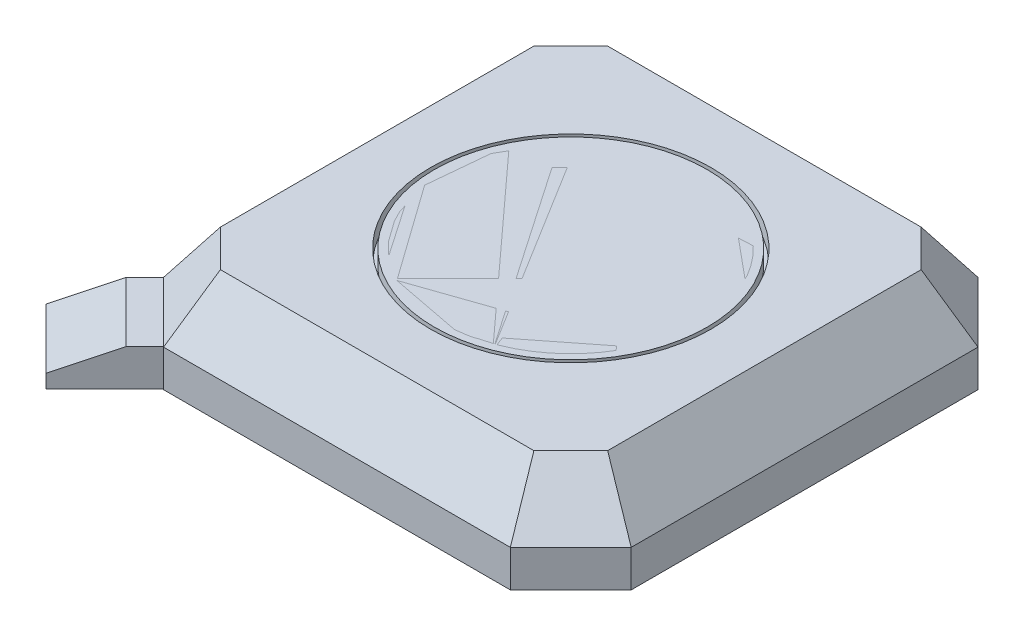
ISO-10303-21;
HEADER;
FILE_DESCRIPTION(('STEP AP214'),'2;1');
FILE_NAME('part.step','',(''),(''),'','','');
FILE_SCHEMA(('AUTOMOTIVE_DESIGN { 1 0 10303 214 1 1 1 1 }'));
ENDSEC;
DATA;
#1=APPLICATION_CONTEXT('core data for automotive mechanical design processes');
#2=APPLICATION_PROTOCOL_DEFINITION('international standard','automotive_design',2000,#1);
#3=PRODUCT_CONTEXT('',#1,'mechanical');
#4=PRODUCT('Part','Part','',(#3));
#5=PRODUCT_RELATED_PRODUCT_CATEGORY('part','',(#4));
#6=PRODUCT_DEFINITION_FORMATION('','',#4);
#7=PRODUCT_DEFINITION_CONTEXT('part definition',#1,'design');
#8=PRODUCT_DEFINITION('design','',#6,#7);
#9=PRODUCT_DEFINITION_SHAPE('','',#8);
#10=(LENGTH_UNIT() NAMED_UNIT(*) SI_UNIT(.MILLI.,.METRE.));
#11=(NAMED_UNIT(*) PLANE_ANGLE_UNIT() SI_UNIT($,.RADIAN.));
#12=(NAMED_UNIT(*) SI_UNIT($,.STERADIAN.) SOLID_ANGLE_UNIT());
#13=UNCERTAINTY_MEASURE_WITH_UNIT(LENGTH_MEASURE(1.E-05),#10,'distance_accuracy_value','');
#14=(GEOMETRIC_REPRESENTATION_CONTEXT(3) GLOBAL_UNCERTAINTY_ASSIGNED_CONTEXT((#13)) GLOBAL_UNIT_ASSIGNED_CONTEXT((#10,
#11,#12)) REPRESENTATION_CONTEXT('',''));
#15=CARTESIAN_POINT('',(0.,0.,0.));
#16=DIRECTION('',(0.,0.,1.));
#17=DIRECTION('',(1.,0.,0.));
#18=AXIS2_PLACEMENT_3D('',#15,#16,#17);
#19=CARTESIAN_POINT('',(-47.1346819527898,-25.,63.2776124984004));
#20=DIRECTION('',(-0.707106781186548,0.,0.707106781186547));
#21=DIRECTION('',(0.707106781186547,0.,0.707106781186548));
#22=AXIS2_PLACEMENT_3D('',#19,#20,#21);
#23=PLANE('',#22);
#24=DIRECTION('',(0.,1.,0.));
#25=VECTOR('',#24,1.);
#26=CARTESIAN_POINT('',(-63.3981379200804,-25.,47.0141565311099));
#27=LINE('',#26,#25);
#28=CARTESIAN_POINT('',(-63.3981379200804,-25.,47.0141565311099));
#29=VERTEX_POINT('',#28);
#30=CARTESIAN_POINT('',(-63.3981379200804,-15.,47.0141565311099));
#31=VERTEX_POINT('',#30);
#32=EDGE_CURVE('E126',#29,#31,#27,.T.);
#33=ORIENTED_EDGE('',*,*,#32,.T.);
#34=DIRECTION('',(-0.707106781186547,0.,-0.707106781186548));
#35=VECTOR('',#34,1.);
#36=CARTESIAN_POINT('',(-47.1346819527898,-15.,63.2776124984004));
#37=LINE('',#36,#35);
#38=CARTESIAN_POINT('',(-47.1346819527898,-15.,63.2776124984004));
#39=VERTEX_POINT('',#38);
#40=EDGE_CURVE('E12',#39,#31,#37,.T.);
#41=ORIENTED_EDGE('',*,*,#40,.F.);
#42=DIRECTION('',(0.,1.,0.));
#43=VECTOR('',#42,1.);
#44=CARTESIAN_POINT('',(-47.1346819527898,-25.,63.2776124984004));
#45=LINE('',#44,#43);
#46=CARTESIAN_POINT('',(-47.1346819527898,-25.,63.2776124984004));
#47=VERTEX_POINT('',#46);
#48=EDGE_CURVE('E134',#47,#39,#45,.T.);
#49=ORIENTED_EDGE('',*,*,#48,.F.);
#50=DIRECTION('',(-0.707106781186547,0.,-0.707106781186548));
#51=VECTOR('',#50,1.);
#52=CARTESIAN_POINT('',(-47.1346819527898,-25.,63.2776124984004));
#53=LINE('',#52,#51);
#54=EDGE_CURVE('E122',#47,#29,#53,.T.);
#55=ORIENTED_EDGE('',*,*,#54,.T.);
#56=EDGE_LOOP('',(#33,#41,#49,#55));
#57=FACE_BOUND('',#56,.T.);
#58=ADVANCED_FACE('F52',(#57),#23,.F.);
#59=CARTESIAN_POINT('',(-47.1346819527898,-15.,63.2776124984004));
#60=DIRECTION('',(0.,-1.,0.));
#61=DIRECTION('',(0.,0.,-1.));
#62=AXIS2_PLACEMENT_3D('',#59,#60,#61);
#63=PLANE('',#62);
#64=DIRECTION('',(-0.707106781186547,0.,0.707106781186547));
#65=VECTOR('',#64,1.);
#66=CARTESIAN_POINT('',(-63.3981379200804,-15.,47.0141565311099));
#67=LINE('',#66,#65);
#68=CARTESIAN_POINT('',(-68.474182046728,-15.,52.0902006577574));
#69=VERTEX_POINT('',#68);
#70=EDGE_CURVE('E129',#31,#69,#67,.T.);
#71=ORIENTED_EDGE('',*,*,#70,.T.);
#72=DIRECTION('',(-0.707106781186547,0.,-0.707106781186548));
#73=VECTOR('',#72,1.);
#74=CARTESIAN_POINT('',(-52.2107260794374,-15.,68.353656625048));
#75=LINE('',#74,#73);
#76=CARTESIAN_POINT('',(-52.2107260794374,-15.,68.353656625048));
#77=VERTEX_POINT('',#76);
#78=EDGE_CURVE('E60',#77,#69,#75,.T.);
#79=ORIENTED_EDGE('',*,*,#78,.F.);
#80=DIRECTION('',(-0.707106781186547,0.,0.707106781186547));
#81=VECTOR('',#80,1.);
#82=CARTESIAN_POINT('',(-47.1346819527898,-15.,63.2776124984004));
#83=LINE('',#82,#81);
#84=EDGE_CURVE('E102',#39,#77,#83,.T.);
#85=ORIENTED_EDGE('',*,*,#84,.F.);
#86=ORIENTED_EDGE('',*,*,#40,.T.);
#87=EDGE_LOOP('',(#71,#79,#85,#86));
#88=FACE_BOUND('',#87,.T.);
#89=ADVANCED_FACE('F153',(#88),#63,.F.);
#90=CARTESIAN_POINT('',(-52.2107260794374,-15.,68.353656625048));
#91=DIRECTION('',(0.266835046425211,-0.926065935016784,-0.266835046425211));
#92=DIRECTION('',(0.960906267352022,0.276873879886864,0.));
#93=AXIS2_PLACEMENT_3D('',#90,#91,#92);
#94=PLANE('',#93);
#95=DIRECTION('',(-0.654827502476229,-0.377361741570988,0.654827502476228));
#96=VECTOR('',#95,1.);
#97=CARTESIAN_POINT('',(-68.474182046728,-15.,52.0902006577574));
#98=LINE('',#97,#96);
#99=CARTESIAN_POINT('',(-79.3343600134854,-21.2584660170947,62.9503786245148));
#100=VERTEX_POINT('',#99);
#101=EDGE_CURVE('E117',#69,#100,#98,.T.);
#102=ORIENTED_EDGE('',*,*,#101,.T.);
#103=DIRECTION('',(-0.707106781186547,0.,-0.707106781186548));
#104=VECTOR('',#103,1.);
#105=CARTESIAN_POINT('',(-63.0709040461948,-21.2584660170947,79.2138345918055));
#106=LINE('',#105,#104);
#107=CARTESIAN_POINT('',(-63.0709040461948,-21.2584660170947,79.2138345918055));
#108=VERTEX_POINT('',#107);
#109=EDGE_CURVE('E114',#108,#100,#106,.T.);
#110=ORIENTED_EDGE('',*,*,#109,.F.);
#111=DIRECTION('',(-0.654827502476229,-0.377361741570988,0.654827502476228));
#112=VECTOR('',#111,1.);
#113=CARTESIAN_POINT('',(-52.2107260794374,-15.,68.353656625048));
#114=LINE('',#113,#112);
#115=EDGE_CURVE('E106',#77,#108,#114,.T.);
#116=ORIENTED_EDGE('',*,*,#115,.F.);
#117=ORIENTED_EDGE('',*,*,#78,.T.);
#118=EDGE_LOOP('',(#102,#110,#116,#117));
#119=FACE_BOUND('',#118,.T.);
#120=ADVANCED_FACE('F115',(#119),#94,.F.);
#121=CARTESIAN_POINT('',(-63.0709040461948,-21.2584660170947,79.2138345918055));
#122=DIRECTION('',(0.707106781186548,0.,-0.707106781186547));
#123=DIRECTION('',(-0.707106781186547,0.,-0.707106781186548));
#124=AXIS2_PLACEMENT_3D('',#121,#122,#123);
#125=PLANE('',#124);
#126=DIRECTION('',(0.,-1.,0.));
#127=VECTOR('',#126,1.);
#128=CARTESIAN_POINT('',(-79.3343600134854,-21.2584660170947,62.9503786245148));
#129=LINE('',#128,#127);
#130=CARTESIAN_POINT('',(-79.3343600134854,-25.,62.9503786245148));
#131=VERTEX_POINT('',#130);
#132=EDGE_CURVE('E88',#100,#131,#129,.T.);
#133=ORIENTED_EDGE('',*,*,#132,.T.);
#134=DIRECTION('',(-0.707106781186547,0.,-0.707106781186548));
#135=VECTOR('',#134,1.);
#136=CARTESIAN_POINT('',(-63.0709040461948,-25.,79.2138345918055));
#137=LINE('',#136,#135);
#138=CARTESIAN_POINT('',(-63.0709040461948,-25.,79.2138345918055));
#139=VERTEX_POINT('',#138);
#140=EDGE_CURVE('E118',#139,#131,#137,.T.);
#141=ORIENTED_EDGE('',*,*,#140,.F.);
#142=DIRECTION('',(0.,-1.,0.));
#143=VECTOR('',#142,1.);
#144=CARTESIAN_POINT('',(-63.0709040461948,-21.2584660170947,79.2138345918055));
#145=LINE('',#144,#143);
#146=EDGE_CURVE('E110',#108,#139,#145,.T.);
#147=ORIENTED_EDGE('',*,*,#146,.F.);
#148=ORIENTED_EDGE('',*,*,#109,.T.);
#149=EDGE_LOOP('',(#133,#141,#147,#148));
#150=FACE_BOUND('',#149,.T.);
#151=ADVANCED_FACE('F120',(#150),#125,.F.);
#152=CARTESIAN_POINT('',(-63.0709040461948,-25.,79.2138345918055));
#153=DIRECTION('',(0.,1.,0.));
#154=DIRECTION('',(0.,0.,1.));
#155=AXIS2_PLACEMENT_3D('',#152,#153,#154);
#156=PLANE('',#155);
#157=DIRECTION('',(0.707106781186548,0.,-0.707106781186547));
#158=VECTOR('',#157,1.);
#159=CARTESIAN_POINT('',(-79.3343600134854,-25.,62.9503786245148));
#160=LINE('',#159,#158);
#161=EDGE_CURVE('E94',#131,#29,#160,.T.);
#162=ORIENTED_EDGE('',*,*,#161,.T.);
#163=ORIENTED_EDGE('',*,*,#54,.F.);
#164=DIRECTION('',(0.707106781186548,0.,-0.707106781186547));
#165=VECTOR('',#164,1.);
#166=CARTESIAN_POINT('',(-63.0709040461948,-25.,79.2138345918055));
#167=LINE('',#166,#165);
#168=EDGE_CURVE('E68',#139,#47,#167,.T.);
#169=ORIENTED_EDGE('',*,*,#168,.F.);
#170=ORIENTED_EDGE('',*,*,#140,.T.);
#171=EDGE_LOOP('',(#162,#163,#169,#170));
#172=FACE_BOUND('',#171,.T.);
#173=ADVANCED_FACE('F142',(#172),#156,.F.);
#174=CARTESIAN_POINT('',(8.07146527280531,0.,8.07146527280532));
#175=DIRECTION('',(0.707106781186548,0.,0.707106781186548));
#176=DIRECTION('',(0.707106781186548,0.,-0.707106781186548));
#177=AXIS2_PLACEMENT_3D('',#174,#175,#176);
#178=PLANE('',#177);
#179=ORIENTED_EDGE('',*,*,#48,.T.);
#180=ORIENTED_EDGE('',*,*,#84,.T.);
#181=ORIENTED_EDGE('',*,*,#115,.T.);
#182=ORIENTED_EDGE('',*,*,#146,.T.);
#183=ORIENTED_EDGE('',*,*,#168,.T.);
#184=EDGE_LOOP('',(#179,#180,#181,#182,#183));
#185=FACE_BOUND('',#184,.T.);
#186=ADVANCED_FACE('F108',(#185),#178,.T.);
#187=CARTESIAN_POINT('',(-8.19199069448528,0.,-8.19199069448528));
#188=DIRECTION('',(0.707106781186548,0.,0.707106781186548));
#189=DIRECTION('',(0.707106781186548,0.,-0.707106781186548));
#190=AXIS2_PLACEMENT_3D('',#187,#188,#189);
#191=PLANE('',#190);
#192=ORIENTED_EDGE('',*,*,#32,.F.);
#193=ORIENTED_EDGE('',*,*,#161,.F.);
#194=ORIENTED_EDGE('',*,*,#132,.F.);
#195=ORIENTED_EDGE('',*,*,#101,.F.);
#196=ORIENTED_EDGE('',*,*,#70,.F.);
#197=EDGE_LOOP('',(#192,#193,#194,#195,#196));
#198=FACE_BOUND('',#197,.T.);
#199=ADVANCED_FACE('F138',(#198),#191,.F.);
#200=CLOSED_SHELL('',(#58,#89,#120,#151,#173,#186,#199));
#201=MANIFOLD_SOLID_BREP('B2',#200);
#202=CARTESIAN_POINT('',(-52.5,0.,-42.5));
#203=DIRECTION('',(-0.809016994374947,0.587785252292473,0.));
#204=DIRECTION('',(-0.587785252292473,-0.809016994374947,0.));
#205=AXIS2_PLACEMENT_3D('',#202,#203,#204);
#206=PLANE('',#205);
#207=DIRECTION('',(0.,0.,1.));
#208=VECTOR('',#207,1.);
#209=CARTESIAN_POINT('',(-52.5,0.,-42.5));
#210=LINE('',#209,#208);
#211=CARTESIAN_POINT('',(-52.5,0.,-42.5));
#212=VERTEX_POINT('',#211);
#213=CARTESIAN_POINT('',(-52.5,0.,42.5));
#214=VERTEX_POINT('',#213);
#215=EDGE_CURVE('E366',#212,#214,#210,.T.);
#216=ORIENTED_EDGE('',*,*,#215,.F.);
#217=DIRECTION('',(0.571102314262895,0.786054900090694,0.236558324070353));
#218=VECTOR('',#217,1.);
#219=CARTESIAN_POINT('',(-50.589411529783,2.6296994278674,-41.7086083435224));
#220=LINE('',#219,#218);
#221=CARTESIAN_POINT('',(-63.3981379200804,-15.,-47.0141565311098));
#222=VERTEX_POINT('',#221);
#223=EDGE_CURVE('E50',#222,#212,#220,.T.);
#224=ORIENTED_EDGE('',*,*,#223,.F.);
#225=DIRECTION('',(0.,0.,1.));
#226=VECTOR('',#225,1.);
#227=CARTESIAN_POINT('',(-63.3981379200804,-15.,0.));
#228=LINE('',#227,#226);
#229=CARTESIAN_POINT('',(-63.3981379200804,-15.,47.0141565311099));
#230=VERTEX_POINT('',#229);
#231=EDGE_CURVE('E350',#222,#230,#228,.T.);
#232=ORIENTED_EDGE('',*,*,#231,.T.);
#233=DIRECTION('',(0.571102314262895,0.786054900090694,-0.236558324070353));
#234=VECTOR('',#233,1.);
#235=CARTESIAN_POINT('',(-41.0165844615479,15.8055655323832,37.7434135416072));
#236=LINE('',#235,#234);
#237=EDGE_CURVE('E392',#230,#214,#236,.T.);
#238=ORIENTED_EDGE('',*,*,#237,.T.);
#239=EDGE_LOOP('',(#216,#224,#232,#238));
#240=FACE_BOUND('',#239,.T.);
#241=ADVANCED_FACE('F237',(#240),#206,.T.);
#242=CARTESIAN_POINT('',(-42.5,0.,-52.5));
#243=DIRECTION('',(-0.572061402817684,0.587785252292473,-0.572061402817684));
#244=DIRECTION('',(-0.716627060372798,-0.697456562333055,0.));
#245=AXIS2_PLACEMENT_3D('',#242,#243,#244);
#246=PLANE('',#245);
#247=DIRECTION('',(-0.707106781186548,0.,0.707106781186548));
#248=VECTOR('',#247,1.);
#249=CARTESIAN_POINT('',(-42.5,0.,-52.5));
#250=LINE('',#249,#248);
#251=CARTESIAN_POINT('',(-42.5,0.,-52.5));
#252=VERTEX_POINT('',#251);
#253=EDGE_CURVE('E389',#252,#212,#250,.T.);
#254=ORIENTED_EDGE('',*,*,#253,.F.);
#255=DIRECTION('',(0.236558324070352,0.786054900090694,0.571102314262895));
#256=VECTOR('',#255,1.);
#257=CARTESIAN_POINT('',(-42.5,0.,-52.5));
#258=LINE('',#257,#256);
#259=CARTESIAN_POINT('',(-47.0141565311098,-15.,-63.3981379200804));
#260=VERTEX_POINT('',#259);
#261=EDGE_CURVE('E246',#260,#252,#258,.T.);
#262=ORIENTED_EDGE('',*,*,#261,.F.);
#263=DIRECTION('',(-0.707106781186548,0.,0.707106781186548));
#264=VECTOR('',#263,1.);
#265=CARTESIAN_POINT('',(-55.2061472255951,-15.,-55.2061472255951));
#266=LINE('',#265,#264);
#267=EDGE_CURVE('E395',#260,#222,#266,.T.);
#268=ORIENTED_EDGE('',*,*,#267,.T.);
#269=ORIENTED_EDGE('',*,*,#223,.T.);
#270=EDGE_LOOP('',(#254,#262,#268,#269));
#271=FACE_BOUND('',#270,.T.);
#272=ADVANCED_FACE('F239',(#271),#246,.T.);
#273=CARTESIAN_POINT('',(-42.5,0.,-52.5));
#274=DIRECTION('',(0.,0.587785252292474,-0.809016994374947));
#275=DIRECTION('',(0.,0.809016994374947,0.587785252292474));
#276=AXIS2_PLACEMENT_3D('',#273,#274,#275);
#277=PLANE('',#276);
#278=DIRECTION('',(-1.,0.,0.));
#279=VECTOR('',#278,1.);
#280=CARTESIAN_POINT('',(-42.5,0.,-52.5));
#281=LINE('',#280,#279);
#282=CARTESIAN_POINT('',(42.5,0.,-52.5));
#283=VERTEX_POINT('',#282);
#284=EDGE_CURVE('E386',#283,#252,#281,.T.);
#285=ORIENTED_EDGE('',*,*,#284,.F.);
#286=DIRECTION('',(-0.236558324070353,0.786054900090694,0.571102314262895));
#287=VECTOR('',#286,1.);
#288=CARTESIAN_POINT('',(42.5,0.,-52.5));
#289=LINE('',#288,#287);
#290=CARTESIAN_POINT('',(47.0141565311098,-15.,-63.3981379200804));
#291=VERTEX_POINT('',#290);
#292=EDGE_CURVE('E403',#291,#283,#289,.T.);
#293=ORIENTED_EDGE('',*,*,#292,.F.);
#294=DIRECTION('',(-1.,0.,0.));
#295=VECTOR('',#294,1.);
#296=CARTESIAN_POINT('',(0.,-15.,-63.3981379200804));
#297=LINE('',#296,#295);
#298=EDGE_CURVE('E408',#291,#260,#297,.T.);
#299=ORIENTED_EDGE('',*,*,#298,.T.);
#300=ORIENTED_EDGE('',*,*,#261,.T.);
#301=EDGE_LOOP('',(#285,#293,#299,#300));
#302=FACE_BOUND('',#301,.T.);
#303=ADVANCED_FACE('F456',(#302),#277,.T.);
#304=CARTESIAN_POINT('',(42.5,0.,-52.5));
#305=DIRECTION('',(0.572061402817684,0.587785252292474,-0.572061402817684));
#306=DIRECTION('',(-0.716627060372798,0.697456562333055,0.));
#307=AXIS2_PLACEMENT_3D('',#304,#305,#306);
#308=PLANE('',#307);
#309=DIRECTION('',(-0.707106781186547,0.,-0.707106781186548));
#310=VECTOR('',#309,1.);
#311=CARTESIAN_POINT('',(42.5,0.,-52.5));
#312=LINE('',#311,#310);
#313=CARTESIAN_POINT('',(52.5,0.,-42.5));
#314=VERTEX_POINT('',#313);
#315=EDGE_CURVE('E383',#314,#283,#312,.T.);
#316=ORIENTED_EDGE('',*,*,#315,.F.);
#317=DIRECTION('',(-0.571102314262895,0.786054900090694,0.236558324070353));
#318=VECTOR('',#317,1.);
#319=CARTESIAN_POINT('',(52.5,0.,-42.5));
#320=LINE('',#319,#318);
#321=CARTESIAN_POINT('',(63.3981379200804,-15.,-47.0141565311098));
#322=VERTEX_POINT('',#321);
#323=EDGE_CURVE('E401',#322,#314,#320,.T.);
#324=ORIENTED_EDGE('',*,*,#323,.F.);
#325=DIRECTION('',(-0.707106781186547,0.,-0.707106781186548));
#326=VECTOR('',#325,1.);
#327=CARTESIAN_POINT('',(55.2061472255951,-15.,-55.2061472255951));
#328=LINE('',#327,#326);
#329=EDGE_CURVE('E411',#322,#291,#328,.T.);
#330=ORIENTED_EDGE('',*,*,#329,.T.);
#331=ORIENTED_EDGE('',*,*,#292,.T.);
#332=EDGE_LOOP('',(#316,#324,#330,#331));
#333=FACE_BOUND('',#332,.T.);
#334=ADVANCED_FACE('F460',(#333),#308,.T.);
#335=CARTESIAN_POINT('',(52.5,0.,-42.5));
#336=DIRECTION('',(0.809016994374947,0.587785252292474,0.));
#337=DIRECTION('',(-0.587785252292474,0.809016994374947,0.));
#338=AXIS2_PLACEMENT_3D('',#335,#336,#337);
#339=PLANE('',#338);
#340=DIRECTION('',(0.,0.,-1.));
#341=VECTOR('',#340,1.);
#342=CARTESIAN_POINT('',(52.5,0.,-42.5));
#343=LINE('',#342,#341);
#344=CARTESIAN_POINT('',(52.5,0.,42.5));
#345=VERTEX_POINT('',#344);
#346=EDGE_CURVE('E380',#345,#314,#343,.T.);
#347=ORIENTED_EDGE('',*,*,#346,.F.);
#348=DIRECTION('',(-0.571102314262895,0.786054900090694,-0.236558324070352));
#349=VECTOR('',#348,1.);
#350=CARTESIAN_POINT('',(50.589411529783,2.62969942786742,41.7086083435225));
#351=LINE('',#350,#349);
#352=CARTESIAN_POINT('',(63.3981379200805,-15.,47.0141565311098));
#353=VERTEX_POINT('',#352);
#354=EDGE_CURVE('E399',#353,#345,#351,.T.);
#355=ORIENTED_EDGE('',*,*,#354,.F.);
#356=DIRECTION('',(0.,0.,-1.));
#357=VECTOR('',#356,1.);
#358=CARTESIAN_POINT('',(63.3981379200805,-15.,0.));
#359=LINE('',#358,#357);
#360=EDGE_CURVE('E414',#353,#322,#359,.T.);
#361=ORIENTED_EDGE('',*,*,#360,.T.);
#362=ORIENTED_EDGE('',*,*,#323,.T.);
#363=EDGE_LOOP('',(#347,#355,#361,#362));
#364=FACE_BOUND('',#363,.T.);
#365=ADVANCED_FACE('F464',(#364),#339,.T.);
#366=CARTESIAN_POINT('',(42.5,0.,52.5));
#367=DIRECTION('',(0.572061402817684,0.587785252292474,0.572061402817684));
#368=DIRECTION('',(-0.716627060372798,0.697456562333055,0.));
#369=AXIS2_PLACEMENT_3D('',#366,#367,#368);
#370=PLANE('',#369);
#371=DIRECTION('',(0.707106781186547,0.,-0.707106781186548));
#372=VECTOR('',#371,1.);
#373=CARTESIAN_POINT('',(42.5,0.,52.5));
#374=LINE('',#373,#372);
#375=CARTESIAN_POINT('',(42.5,0.,52.5));
#376=VERTEX_POINT('',#375);
#377=EDGE_CURVE('E377',#376,#345,#374,.T.);
#378=ORIENTED_EDGE('',*,*,#377,.F.);
#379=DIRECTION('',(-0.236558324070353,0.786054900090694,-0.571102314262895));
#380=VECTOR('',#379,1.);
#381=CARTESIAN_POINT('',(37.7434135416072,15.8055655323832,41.0165844615479));
#382=LINE('',#381,#380);
#383=CARTESIAN_POINT('',(47.0141565311099,-15.,63.3981379200805));
#384=VERTEX_POINT('',#383);
#385=EDGE_CURVE('E397',#384,#376,#382,.T.);
#386=ORIENTED_EDGE('',*,*,#385,.F.);
#387=DIRECTION('',(0.707106781186547,0.,-0.707106781186548));
#388=VECTOR('',#387,1.);
#389=CARTESIAN_POINT('',(55.2061472255952,-15.,55.2061472255951));
#390=LINE('',#389,#388);
#391=EDGE_CURVE('E417',#384,#353,#390,.T.);
#392=ORIENTED_EDGE('',*,*,#391,.T.);
#393=ORIENTED_EDGE('',*,*,#354,.T.);
#394=EDGE_LOOP('',(#378,#386,#392,#393));
#395=FACE_BOUND('',#394,.T.);
#396=ADVANCED_FACE('F487',(#395),#370,.T.);
#397=CARTESIAN_POINT('',(-42.5,0.,52.5));
#398=DIRECTION('',(0.,0.587785252292474,0.809016994374947));
#399=DIRECTION('',(0.,-0.809016994374947,0.587785252292474));
#400=AXIS2_PLACEMENT_3D('',#397,#398,#399);
#401=PLANE('',#400);
#402=DIRECTION('',(1.,0.,0.));
#403=VECTOR('',#402,1.);
#404=CARTESIAN_POINT('',(-42.5,0.,52.5));
#405=LINE('',#404,#403);
#406=CARTESIAN_POINT('',(-42.5,0.,52.5));
#407=VERTEX_POINT('',#406);
#408=EDGE_CURVE('E374',#407,#376,#405,.T.);
#409=ORIENTED_EDGE('',*,*,#408,.F.);
#410=DIRECTION('',(0.236558324070353,0.786054900090694,-0.571102314262895));
#411=VECTOR('',#410,1.);
#412=CARTESIAN_POINT('',(-41.7086083435224,2.6296994278674,50.589411529783));
#413=LINE('',#412,#411);
#414=CARTESIAN_POINT('',(-47.0141565311098,-15.,63.3981379200805));
#415=VERTEX_POINT('',#414);
#416=EDGE_CURVE('E394',#415,#407,#413,.T.);
#417=ORIENTED_EDGE('',*,*,#416,.F.);
#418=DIRECTION('',(1.,0.,0.));
#419=VECTOR('',#418,1.);
#420=CARTESIAN_POINT('',(0.,-15.,63.3981379200805));
#421=LINE('',#420,#419);
#422=EDGE_CURVE('E419',#415,#384,#421,.T.);
#423=ORIENTED_EDGE('',*,*,#422,.T.);
#424=ORIENTED_EDGE('',*,*,#385,.T.);
#425=EDGE_LOOP('',(#409,#417,#423,#424));
#426=FACE_BOUND('',#425,.T.);
#427=ADVANCED_FACE('F488',(#426),#401,.T.);
#428=CARTESIAN_POINT('',(-52.5,0.,42.5));
#429=DIRECTION('',(-0.572061402817684,0.587785252292473,0.572061402817684));
#430=DIRECTION('',(-0.716627060372798,-0.697456562333055,0.));
#431=AXIS2_PLACEMENT_3D('',#428,#429,#430);
#432=PLANE('',#431);
#433=DIRECTION('',(0.707106781186547,0.,0.707106781186548));
#434=VECTOR('',#433,1.);
#435=CARTESIAN_POINT('',(-52.5,0.,42.5));
#436=LINE('',#435,#434);
#437=EDGE_CURVE('E371',#214,#407,#436,.T.);
#438=ORIENTED_EDGE('',*,*,#437,.F.);
#439=ORIENTED_EDGE('',*,*,#237,.F.);
#440=DIRECTION('',(0.707106781186547,0.,0.707106781186548));
#441=VECTOR('',#440,1.);
#442=CARTESIAN_POINT('',(-55.2061472255952,-15.,55.2061472255951));
#443=LINE('',#442,#441);
#444=EDGE_CURVE('E241',#230,#415,#443,.T.);
#445=ORIENTED_EDGE('',*,*,#444,.T.);
#446=ORIENTED_EDGE('',*,*,#416,.T.);
#447=EDGE_LOOP('',(#438,#439,#445,#446));
#448=FACE_BOUND('',#447,.T.);
#449=ADVANCED_FACE('F427',(#448),#432,.T.);
#450=CARTESIAN_POINT('',(0.,0.,0.));
#451=DIRECTION('',(0.,1.,0.));
#452=DIRECTION('',(-1.,0.,0.));
#453=AXIS2_PLACEMENT_3D('',#450,#451,#452);
#454=PLANE('',#453);
#455=CARTESIAN_POINT('',(0.,0.,0.));
#456=DIRECTION('',(0.,1.,0.));
#457=DIRECTION('',(-1.,0.,0.));
#458=AXIS2_PLACEMENT_3D('',#455,#456,#457);
#459=CIRCLE('',#458,38.);
#460=CARTESIAN_POINT('',(-38.,0.,0.));
#461=VERTEX_POINT('',#460);
#462=EDGE_CURVE('E361',#461,#461,#459,.T.);
#463=ORIENTED_EDGE('',*,*,#462,.F.);
#464=EDGE_LOOP('',(#463));
#465=FACE_BOUND('',#464,.T.);
#466=ORIENTED_EDGE('',*,*,#215,.T.);
#467=ORIENTED_EDGE('',*,*,#437,.T.);
#468=ORIENTED_EDGE('',*,*,#408,.T.);
#469=ORIENTED_EDGE('',*,*,#377,.T.);
#470=ORIENTED_EDGE('',*,*,#346,.T.);
#471=ORIENTED_EDGE('',*,*,#315,.T.);
#472=ORIENTED_EDGE('',*,*,#284,.T.);
#473=ORIENTED_EDGE('',*,*,#253,.T.);
#474=EDGE_LOOP('',(#466,#467,#468,#469,#470,#471,#472,#473));
#475=FACE_BOUND('',#474,.T.);
#476=ADVANCED_FACE('F483',(#465,#475),#454,.T.);
#477=CARTESIAN_POINT('',(0.,-4.,0.));
#478=DIRECTION('',(0.,1.,0.));
#479=DIRECTION('',(-1.,0.,0.));
#480=AXIS2_PLACEMENT_3D('',#477,#478,#479);
#481=CYLINDRICAL_SURFACE('',#480,38.);
#482=CARTESIAN_POINT('',(0.,-4.,0.));
#483=DIRECTION('',(0.,1.,0.));
#484=DIRECTION('',(-1.,0.,0.));
#485=AXIS2_PLACEMENT_3D('',#482,#483,#484);
#486=CIRCLE('',#485,38.);
#487=CARTESIAN_POINT('',(-38.,-4.00000000000001,0.));
#488=VERTEX_POINT('',#487);
#489=EDGE_CURVE('E363',#488,#488,#486,.T.);
#490=ORIENTED_EDGE('',*,*,#489,.F.);
#491=EDGE_LOOP('',(#490));
#492=FACE_BOUND('',#491,.T.);
#493=ORIENTED_EDGE('',*,*,#462,.T.);
#494=EDGE_LOOP('',(#493));
#495=FACE_BOUND('',#494,.T.);
#496=ADVANCED_FACE('F538',(#492,#495),#481,.F.);
#497=CARTESIAN_POINT('',(0.,-4.,0.));
#498=DIRECTION('',(0.,1.,0.));
#499=DIRECTION('',(-1.,0.,0.));
#500=AXIS2_PLACEMENT_3D('',#497,#498,#499);
#501=PLANE('',#500);
#502=CARTESIAN_POINT('',(0.,-4.,0.));
#503=DIRECTION('',(0.,1.,0.));
#504=DIRECTION('',(-1.,0.,0.));
#505=AXIS2_PLACEMENT_3D('',#502,#503,#504);
#506=CIRCLE('',#505,37.);
#507=CARTESIAN_POINT('',(-37.,-4.00000000000001,0.));
#508=VERTEX_POINT('',#507);
#509=EDGE_CURVE('E354',#508,#508,#506,.T.);
#510=ORIENTED_EDGE('',*,*,#509,.F.);
#511=EDGE_LOOP('',(#510));
#512=FACE_BOUND('',#511,.T.);
#513=ORIENTED_EDGE('',*,*,#489,.T.);
#514=EDGE_LOOP('',(#513));
#515=FACE_BOUND('',#514,.T.);
#516=ADVANCED_FACE('F546',(#512,#515),#501,.T.);
#517=CARTESIAN_POINT('',(0.,-4.,0.));
#518=DIRECTION('',(0.,1.,0.));
#519=DIRECTION('',(-1.,0.,0.));
#520=AXIS2_PLACEMENT_3D('',#517,#518,#519);
#521=CYLINDRICAL_SURFACE('',#520,37.);
#522=ORIENTED_EDGE('',*,*,#509,.T.);
#523=EDGE_LOOP('',(#522));
#524=FACE_BOUND('',#523,.T.);
#525=CARTESIAN_POINT('',(0.,0.,0.));
#526=DIRECTION('',(0.,1.,0.));
#527=DIRECTION('',(-1.,0.,0.));
#528=AXIS2_PLACEMENT_3D('',#525,#526,#527);
#529=CIRCLE('',#528,37.);
#530=CARTESIAN_POINT('',(-37.,0.,0.));
#531=VERTEX_POINT('',#530);
#532=EDGE_CURVE('E351',#531,#531,#529,.T.);
#533=ORIENTED_EDGE('',*,*,#532,.F.);
#534=EDGE_LOOP('',(#533));
#535=FACE_BOUND('',#534,.T.);
#536=ADVANCED_FACE('F553',(#524,#535),#521,.T.);
#537=ORIENTED_EDGE('',*,*,#532,.T.);
#538=EDGE_LOOP('',(#537));
#539=FACE_BOUND('',#538,.T.);
#540=ADVANCED_FACE('F540',(#539),#454,.T.);
#541=CARTESIAN_POINT('',(-63.3981379200804,-25.,-47.0141565311098));
#542=DIRECTION('',(1.,0.,0.));
#543=DIRECTION('',(0.,0.,-1.));
#544=AXIS2_PLACEMENT_3D('',#541,#542,#543);
#545=PLANE('',#544);
#546=ORIENTED_EDGE('',*,*,#231,.F.);
#547=DIRECTION('',(0.,1.,0.));
#548=VECTOR('',#547,1.);
#549=CARTESIAN_POINT('',(-63.3981379200804,-25.,-47.0141565311098));
#550=LINE('',#549,#548);
#551=CARTESIAN_POINT('',(-63.3981379200804,-25.,-47.0141565311098));
#552=VERTEX_POINT('',#551);
#553=EDGE_CURVE('E332',#552,#222,#550,.T.);
#554=ORIENTED_EDGE('',*,*,#553,.F.);
#555=DIRECTION('',(0.,0.,-1.));
#556=VECTOR('',#555,1.);
#557=CARTESIAN_POINT('',(-63.3981379200804,-25.,-47.0141565311098));
#558=LINE('',#557,#556);
#559=CARTESIAN_POINT('',(-63.3981379200804,-25.,47.0141565311099));
#560=VERTEX_POINT('',#559);
#561=EDGE_CURVE('E339',#560,#552,#558,.T.);
#562=ORIENTED_EDGE('',*,*,#561,.F.);
#563=DIRECTION('',(0.,1.,0.));
#564=VECTOR('',#563,1.);
#565=CARTESIAN_POINT('',(-63.3981379200804,-25.,47.0141565311099));
#566=LINE('',#565,#564);
#567=EDGE_CURVE('E430',#560,#230,#566,.T.);
#568=ORIENTED_EDGE('',*,*,#567,.T.);
#569=EDGE_LOOP('',(#546,#554,#562,#568));
#570=FACE_BOUND('',#569,.T.);
#571=ADVANCED_FACE('F348',(#570),#545,.F.);
#572=CARTESIAN_POINT('',(-47.0141565311098,-25.,-63.3981379200804));
#573=DIRECTION('',(0.707106781186548,0.,0.707106781186548));
#574=DIRECTION('',(0.707106781186548,0.,-0.707106781186548));
#575=AXIS2_PLACEMENT_3D('',#572,#573,#574);
#576=PLANE('',#575);
#577=ORIENTED_EDGE('',*,*,#267,.F.);
#578=DIRECTION('',(0.,1.,0.));
#579=VECTOR('',#578,1.);
#580=CARTESIAN_POINT('',(-47.0141565311098,-25.,-63.3981379200804));
#581=LINE('',#580,#579);
#582=CARTESIAN_POINT('',(-47.0141565311098,-25.,-63.3981379200804));
#583=VERTEX_POINT('',#582);
#584=EDGE_CURVE('E335',#583,#260,#581,.T.);
#585=ORIENTED_EDGE('',*,*,#584,.F.);
#586=DIRECTION('',(0.707106781186548,0.,-0.707106781186548));
#587=VECTOR('',#586,1.);
#588=CARTESIAN_POINT('',(-47.0141565311098,-25.,-63.3981379200804));
#589=LINE('',#588,#587);
#590=EDGE_CURVE('E328',#552,#583,#589,.T.);
#591=ORIENTED_EDGE('',*,*,#590,.F.);
#592=ORIENTED_EDGE('',*,*,#553,.T.);
#593=EDGE_LOOP('',(#577,#585,#591,#592));
#594=FACE_BOUND('',#593,.T.);
#595=ADVANCED_FACE('F330',(#594),#576,.F.);
#596=CARTESIAN_POINT('',(47.0141565311098,-25.,-63.3981379200804));
#597=DIRECTION('',(0.,0.,1.));
#598=DIRECTION('',(1.,0.,0.));
#599=AXIS2_PLACEMENT_3D('',#596,#597,#598);
#600=PLANE('',#599);
#601=ORIENTED_EDGE('',*,*,#298,.F.);
#602=DIRECTION('',(0.,1.,0.));
#603=VECTOR('',#602,1.);
#604=CARTESIAN_POINT('',(47.0141565311098,-25.,-63.3981379200804));
#605=LINE('',#604,#603);
#606=CARTESIAN_POINT('',(47.0141565311098,-25.,-63.3981379200804));
#607=VERTEX_POINT('',#606);
#608=EDGE_CURVE('E356',#607,#291,#605,.T.);
#609=ORIENTED_EDGE('',*,*,#608,.F.);
#610=DIRECTION('',(1.,0.,0.));
#611=VECTOR('',#610,1.);
#612=CARTESIAN_POINT('',(47.0141565311098,-25.,-63.3981379200804));
#613=LINE('',#612,#611);
#614=EDGE_CURVE('E338',#583,#607,#613,.T.);
#615=ORIENTED_EDGE('',*,*,#614,.F.);
#616=ORIENTED_EDGE('',*,*,#584,.T.);
#617=EDGE_LOOP('',(#601,#609,#615,#616));
#618=FACE_BOUND('',#617,.T.);
#619=ADVANCED_FACE('F480',(#618),#600,.F.);
#620=CARTESIAN_POINT('',(63.3981379200804,-25.,-47.0141565311098));
#621=DIRECTION('',(-0.707106781186548,0.,0.707106781186547));
#622=DIRECTION('',(0.707106781186547,0.,0.707106781186548));
#623=AXIS2_PLACEMENT_3D('',#620,#621,#622);
#624=PLANE('',#623);
#625=ORIENTED_EDGE('',*,*,#329,.F.);
#626=DIRECTION('',(0.,1.,0.));
#627=VECTOR('',#626,1.);
#628=CARTESIAN_POINT('',(63.3981379200804,-25.,-47.0141565311098));
#629=LINE('',#628,#627);
#630=CARTESIAN_POINT('',(63.3981379200804,-25.,-47.0141565311098));
#631=VERTEX_POINT('',#630);
#632=EDGE_CURVE('E443',#631,#322,#629,.T.);
#633=ORIENTED_EDGE('',*,*,#632,.F.);
#634=DIRECTION('',(0.707106781186547,0.,0.707106781186548));
#635=VECTOR('',#634,1.);
#636=CARTESIAN_POINT('',(63.3981379200804,-25.,-47.0141565311098));
#637=LINE('',#636,#635);
#638=EDGE_CURVE('E452',#607,#631,#637,.T.);
#639=ORIENTED_EDGE('',*,*,#638,.F.);
#640=ORIENTED_EDGE('',*,*,#608,.T.);
#641=EDGE_LOOP('',(#625,#633,#639,#640));
#642=FACE_BOUND('',#641,.T.);
#643=ADVANCED_FACE('F450',(#642),#624,.F.);
#644=CARTESIAN_POINT('',(63.3981379200805,-25.,47.0141565311098));
#645=DIRECTION('',(-1.,0.,0.));
#646=DIRECTION('',(0.,-1.,0.));
#647=AXIS2_PLACEMENT_3D('',#644,#645,#646);
#648=PLANE('',#647);
#649=ORIENTED_EDGE('',*,*,#360,.F.);
#650=DIRECTION('',(0.,1.,0.));
#651=VECTOR('',#650,1.);
#652=CARTESIAN_POINT('',(63.3981379200805,-25.,47.0141565311098));
#653=LINE('',#652,#651);
#654=CARTESIAN_POINT('',(63.3981379200805,-25.,47.0141565311098));
#655=VERTEX_POINT('',#654);
#656=EDGE_CURVE('E440',#655,#353,#653,.T.);
#657=ORIENTED_EDGE('',*,*,#656,.F.);
#658=DIRECTION('',(0.,0.,1.));
#659=VECTOR('',#658,1.);
#660=CARTESIAN_POINT('',(63.3981379200805,-25.,47.0141565311098));
#661=LINE('',#660,#659);
#662=EDGE_CURVE('E475',#631,#655,#661,.T.);
#663=ORIENTED_EDGE('',*,*,#662,.F.);
#664=ORIENTED_EDGE('',*,*,#632,.T.);
#665=EDGE_LOOP('',(#649,#657,#663,#664));
#666=FACE_BOUND('',#665,.T.);
#667=ADVANCED_FACE('F467',(#666),#648,.F.);
#668=CARTESIAN_POINT('',(47.0141565311099,-25.,63.3981379200805));
#669=DIRECTION('',(-0.707106781186548,0.,-0.707106781186547));
#670=DIRECTION('',(-0.707106781186547,0.,0.707106781186548));
#671=AXIS2_PLACEMENT_3D('',#668,#669,#670);
#672=PLANE('',#671);
#673=ORIENTED_EDGE('',*,*,#391,.F.);
#674=DIRECTION('',(0.,1.,0.));
#675=VECTOR('',#674,1.);
#676=CARTESIAN_POINT('',(47.0141565311099,-25.,63.3981379200805));
#677=LINE('',#676,#675);
#678=CARTESIAN_POINT('',(47.0141565311099,-25.,63.3981379200805));
#679=VERTEX_POINT('',#678);
#680=EDGE_CURVE('E432',#679,#384,#677,.T.);
#681=ORIENTED_EDGE('',*,*,#680,.F.);
#682=DIRECTION('',(-0.707106781186547,0.,0.707106781186548));
#683=VECTOR('',#682,1.);
#684=CARTESIAN_POINT('',(47.0141565311099,-25.,63.3981379200805));
#685=LINE('',#684,#683);
#686=EDGE_CURVE('E473',#655,#679,#685,.T.);
#687=ORIENTED_EDGE('',*,*,#686,.F.);
#688=ORIENTED_EDGE('',*,*,#656,.T.);
#689=EDGE_LOOP('',(#673,#681,#687,#688));
#690=FACE_BOUND('',#689,.T.);
#691=ADVANCED_FACE('F471',(#690),#672,.F.);
#692=CARTESIAN_POINT('',(-47.0141565311098,-25.,63.3981379200805));
#693=DIRECTION('',(0.,0.,-1.));
#694=DIRECTION('',(-1.,0.,0.));
#695=AXIS2_PLACEMENT_3D('',#692,#693,#694);
#696=PLANE('',#695);
#697=ORIENTED_EDGE('',*,*,#422,.F.);
#698=DIRECTION('',(0.,1.,0.));
#699=VECTOR('',#698,1.);
#700=CARTESIAN_POINT('',(-47.0141565311098,-25.,63.3981379200805));
#701=LINE('',#700,#699);
#702=CARTESIAN_POINT('',(-47.0141565311098,-25.,63.3981379200805));
#703=VERTEX_POINT('',#702);
#704=EDGE_CURVE('E254',#703,#415,#701,.T.);
#705=ORIENTED_EDGE('',*,*,#704,.F.);
#706=DIRECTION('',(-1.,0.,0.));
#707=VECTOR('',#706,1.);
#708=CARTESIAN_POINT('',(-47.0141565311098,-25.,63.3981379200805));
#709=LINE('',#708,#707);
#710=EDGE_CURVE('E434',#679,#703,#709,.T.);
#711=ORIENTED_EDGE('',*,*,#710,.F.);
#712=ORIENTED_EDGE('',*,*,#680,.T.);
#713=EDGE_LOOP('',(#697,#705,#711,#712));
#714=FACE_BOUND('',#713,.T.);
#715=ADVANCED_FACE('F604',(#714),#696,.F.);
#716=CARTESIAN_POINT('',(-63.3981379200804,-25.,47.0141565311099));
#717=DIRECTION('',(0.707106781186548,0.,-0.707106781186547));
#718=DIRECTION('',(-0.707106781186547,0.,-0.707106781186548));
#719=AXIS2_PLACEMENT_3D('',#716,#717,#718);
#720=PLANE('',#719);
#721=ORIENTED_EDGE('',*,*,#444,.F.);
#722=ORIENTED_EDGE('',*,*,#567,.F.);
#723=DIRECTION('',(-0.707106781186547,0.,-0.707106781186548));
#724=VECTOR('',#723,1.);
#725=CARTESIAN_POINT('',(-63.3981379200804,-25.,47.0141565311099));
#726=LINE('',#725,#724);
#727=EDGE_CURVE('E343',#703,#560,#726,.T.);
#728=ORIENTED_EDGE('',*,*,#727,.F.);
#729=ORIENTED_EDGE('',*,*,#704,.T.);
#730=EDGE_LOOP('',(#721,#722,#728,#729));
#731=FACE_BOUND('',#730,.T.);
#732=ADVANCED_FACE('F429',(#731),#720,.F.);
#733=CARTESIAN_POINT('',(0.,-25.,0.));
#734=DIRECTION('',(0.,1.,0.));
#735=DIRECTION('',(-1.,0.,0.));
#736=AXIS2_PLACEMENT_3D('',#733,#734,#735);
#737=PLANE('',#736);
#738=ORIENTED_EDGE('',*,*,#561,.T.);
#739=ORIENTED_EDGE('',*,*,#590,.T.);
#740=ORIENTED_EDGE('',*,*,#614,.T.);
#741=ORIENTED_EDGE('',*,*,#638,.T.);
#742=ORIENTED_EDGE('',*,*,#662,.T.);
#743=ORIENTED_EDGE('',*,*,#686,.T.);
#744=ORIENTED_EDGE('',*,*,#710,.T.);
#745=ORIENTED_EDGE('',*,*,#727,.T.);
#746=EDGE_LOOP('',(#738,#739,#740,#741,#742,#743,#744,#745));
#747=FACE_BOUND('',#746,.T.);
#748=ADVANCED_FACE('F342',(#747),#737,.F.);
#749=CLOSED_SHELL('',(#241,#272,#303,#334,#365,#396,#427,#449,#476,#496,#516,#536,#540,#571,
#595,#619,#643,#667,#691,#715,#732,#748));
#750=MANIFOLD_SOLID_BREP('B6',#749);
#751=CARTESIAN_POINT('',(0.,-4.,0.));
#752=DIRECTION('',(0.,1.,0.));
#753=DIRECTION('',(0.,0.,1.));
#754=AXIS2_PLACEMENT_3D('',#751,#752,#753);
#755=CYLINDRICAL_SURFACE('',#754,35.);
#756=CARTESIAN_POINT('',(0.,-4.,0.));
#757=DIRECTION('',(0.,-1.,0.));
#758=DIRECTION('',(0.,0.,-1.));
#759=AXIS2_PLACEMENT_3D('',#756,#757,#758);
#760=CIRCLE('',#759,35.);
#761=CARTESIAN_POINT('',(0.,-4.,-35.));
#762=VERTEX_POINT('',#761);
#763=EDGE_CURVE('E236',#762,#762,#760,.T.);
#764=ORIENTED_EDGE('',*,*,#763,.F.);
#765=EDGE_LOOP('',(#764));
#766=FACE_BOUND('',#765,.T.);
#767=CARTESIAN_POINT('',(0.,0.,0.));
#768=DIRECTION('',(0.,-1.,0.));
#769=DIRECTION('',(0.,0.,-1.));
#770=AXIS2_PLACEMENT_3D('',#767,#768,#769);
#771=CIRCLE('',#770,35.);
#772=CARTESIAN_POINT('',(0.,0.,-35.));
#773=VERTEX_POINT('',#772);
#774=EDGE_CURVE('E775',#773,#773,#771,.T.);
#775=ORIENTED_EDGE('',*,*,#774,.T.);
#776=EDGE_LOOP('',(#775));
#777=FACE_BOUND('',#776,.T.);
#778=ADVANCED_FACE('F772',(#766,#777),#755,.T.);
#779=CARTESIAN_POINT('',(0.,-4.,0.));
#780=DIRECTION('',(0.,-1.,0.));
#781=DIRECTION('',(0.,0.,-1.));
#782=AXIS2_PLACEMENT_3D('',#779,#780,#781);
#783=PLANE('',#782);
#784=ORIENTED_EDGE('',*,*,#763,.T.);
#785=EDGE_LOOP('',(#784));
#786=FACE_BOUND('',#785,.T.);
#787=ADVANCED_FACE('F787',(#786),#783,.T.);
#788=CARTESIAN_POINT('',(0.,0.,0.));
#789=DIRECTION('',(0.,-1.,0.));
#790=DIRECTION('',(0.,0.,-1.));
#791=AXIS2_PLACEMENT_3D('',#788,#789,#790);
#792=PLANE('',#791);
#793=ORIENTED_EDGE('',*,*,#774,.F.);
#794=EDGE_LOOP('',(#793));
#795=FACE_BOUND('',#794,.T.);
#796=ADVANCED_FACE('F785',(#795),#792,.F.);
#797=CLOSED_SHELL('',(#778,#787,#796));
#798=MANIFOLD_SOLID_BREP('B44',#797);
#799=ADVANCED_BREP_SHAPE_REPRESENTATION('',(#18,#201,#750,#798),#14);
#800=SHAPE_DEFINITION_REPRESENTATION(#9,#799);
ENDSEC;
END-ISO-10303-21;
